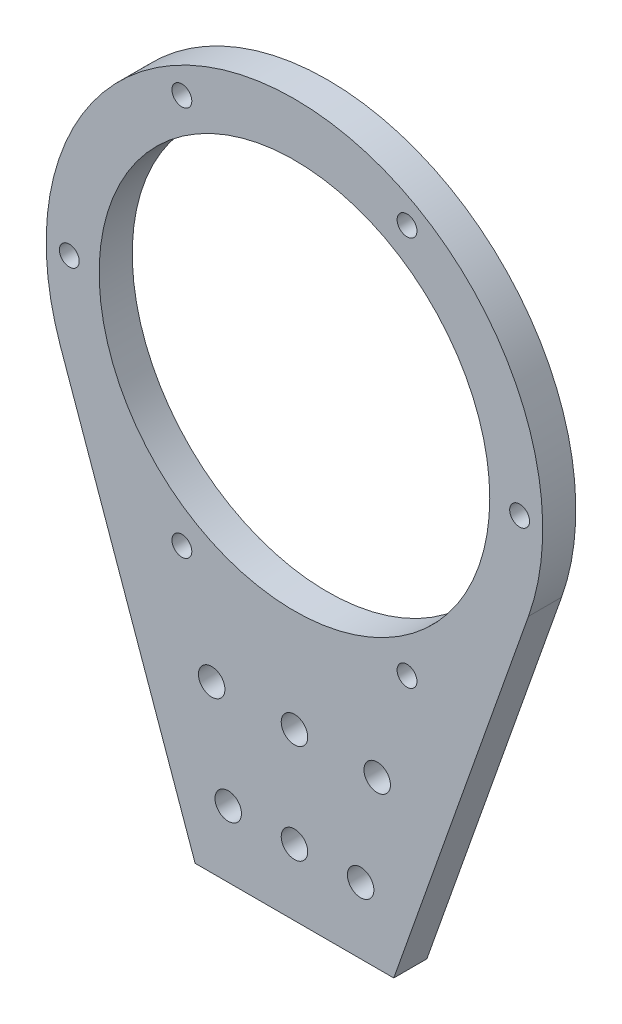
ISO-10303-21;
HEADER;
FILE_DESCRIPTION(('STEP AP214'),'2;1');
FILE_NAME('part.step','',(''),(''),'','','');
FILE_SCHEMA(('AUTOMOTIVE_DESIGN { 1 0 10303 214 1 1 1 1 }'));
ENDSEC;
DATA;
#1=APPLICATION_CONTEXT('core data for automotive mechanical design processes');
#2=APPLICATION_PROTOCOL_DEFINITION('international standard','automotive_design',2000,#1);
#3=PRODUCT_CONTEXT('',#1,'mechanical');
#4=PRODUCT('Part','Part','',(#3));
#5=PRODUCT_RELATED_PRODUCT_CATEGORY('part','',(#4));
#6=PRODUCT_DEFINITION_FORMATION('','',#4);
#7=PRODUCT_DEFINITION_CONTEXT('part definition',#1,'design');
#8=PRODUCT_DEFINITION('design','',#6,#7);
#9=PRODUCT_DEFINITION_SHAPE('','',#8);
#10=(LENGTH_UNIT() NAMED_UNIT(*) SI_UNIT(.MILLI.,.METRE.));
#11=(NAMED_UNIT(*) PLANE_ANGLE_UNIT() SI_UNIT($,.RADIAN.));
#12=(NAMED_UNIT(*) SI_UNIT($,.STERADIAN.) SOLID_ANGLE_UNIT());
#13=UNCERTAINTY_MEASURE_WITH_UNIT(LENGTH_MEASURE(1.E-05),#10,'distance_accuracy_value','');
#14=(GEOMETRIC_REPRESENTATION_CONTEXT(3) GLOBAL_UNCERTAINTY_ASSIGNED_CONTEXT((#13)) GLOBAL_UNIT_ASSIGNED_CONTEXT((#10,
#11,#12)) REPRESENTATION_CONTEXT('',''));
#15=CARTESIAN_POINT('',(0.,0.,0.));
#16=DIRECTION('',(0.,0.,1.));
#17=DIRECTION('',(1.,0.,0.));
#18=AXIS2_PLACEMENT_3D('',#15,#16,#17);
#19=CARTESIAN_POINT('',(0.,0.,0.));
#20=DIRECTION('',(0.,0.,1.));
#21=DIRECTION('',(1.,0.,0.));
#22=AXIS2_PLACEMENT_3D('',#19,#20,#21);
#23=PLANE('',#22);
#24=CARTESIAN_POINT('',(-17.0050000000002,29.4535239827087,0.));
#25=DIRECTION('',(0.,0.,1.));
#26=DIRECTION('',(1.,0.,0.));
#27=AXIS2_PLACEMENT_3D('',#24,#25,#26);
#28=CIRCLE('',#27,1.5);
#29=CARTESIAN_POINT('',(-15.5050000000001,29.4535239827087,0.));
#30=VERTEX_POINT('',#29);
#31=EDGE_CURVE('E199',#30,#30,#28,.T.);
#32=ORIENTED_EDGE('',*,*,#31,.T.);
#33=EDGE_LOOP('',(#32));
#34=FACE_BOUND('',#33,.T.);
#35=CARTESIAN_POINT('',(-34.01,0.,0.));
#36=DIRECTION('',(0.,0.,1.));
#37=DIRECTION('',(1.,0.,0.));
#38=AXIS2_PLACEMENT_3D('',#35,#36,#37);
#39=CIRCLE('',#38,1.5);
#40=CARTESIAN_POINT('',(-32.51,0.,0.));
#41=VERTEX_POINT('',#40);
#42=EDGE_CURVE('E202',#41,#41,#39,.T.);
#43=ORIENTED_EDGE('',*,*,#42,.T.);
#44=EDGE_LOOP('',(#43));
#45=FACE_BOUND('',#44,.T.);
#46=CARTESIAN_POINT('',(-17.0050000000001,-29.4535239827087,0.));
#47=DIRECTION('',(0.,0.,1.));
#48=DIRECTION('',(1.,0.,0.));
#49=AXIS2_PLACEMENT_3D('',#46,#47,#48);
#50=CIRCLE('',#49,1.5);
#51=CARTESIAN_POINT('',(-15.5050000000001,-29.4535239827087,0.));
#52=VERTEX_POINT('',#51);
#53=EDGE_CURVE('E205',#52,#52,#50,.T.);
#54=ORIENTED_EDGE('',*,*,#53,.T.);
#55=EDGE_LOOP('',(#54));
#56=FACE_BOUND('',#55,.T.);
#57=CARTESIAN_POINT('',(17.0050000000001,-29.4535239827087,0.));
#58=DIRECTION('',(0.,0.,1.));
#59=DIRECTION('',(1.,0.,0.));
#60=AXIS2_PLACEMENT_3D('',#57,#58,#59);
#61=CIRCLE('',#60,1.50000000000001);
#62=CARTESIAN_POINT('',(18.5050000000002,-29.4535239827087,0.));
#63=VERTEX_POINT('',#62);
#64=EDGE_CURVE('E208',#63,#63,#61,.T.);
#65=ORIENTED_EDGE('',*,*,#64,.T.);
#66=EDGE_LOOP('',(#65));
#67=FACE_BOUND('',#66,.T.);
#68=CARTESIAN_POINT('',(34.01,0.,0.));
#69=DIRECTION('',(0.,0.,1.));
#70=DIRECTION('',(1.,0.,0.));
#71=AXIS2_PLACEMENT_3D('',#68,#69,#70);
#72=CIRCLE('',#71,1.5);
#73=CARTESIAN_POINT('',(35.51,0.,0.));
#74=VERTEX_POINT('',#73);
#75=EDGE_CURVE('E211',#74,#74,#72,.T.);
#76=ORIENTED_EDGE('',*,*,#75,.T.);
#77=EDGE_LOOP('',(#76));
#78=FACE_BOUND('',#77,.T.);
#79=CARTESIAN_POINT('',(17.0050000000001,29.4535239827087,0.));
#80=DIRECTION('',(0.,0.,1.));
#81=DIRECTION('',(1.,0.,0.));
#82=AXIS2_PLACEMENT_3D('',#79,#80,#81);
#83=CIRCLE('',#82,1.5);
#84=CARTESIAN_POINT('',(18.5050000000001,29.4535239827087,0.));
#85=VERTEX_POINT('',#84);
#86=EDGE_CURVE('E214',#85,#85,#83,.T.);
#87=ORIENTED_EDGE('',*,*,#86,.T.);
#88=EDGE_LOOP('',(#87));
#89=FACE_BOUND('',#88,.T.);
#90=CARTESIAN_POINT('',(0.,-45.0000000000001,0.));
#91=DIRECTION('',(0.,0.,-1.));
#92=DIRECTION('',(-1.,0.,0.));
#93=AXIS2_PLACEMENT_3D('',#90,#91,#92);
#94=CIRCLE('',#93,2.);
#95=CARTESIAN_POINT('',(-2.,-45.0000000000001,0.));
#96=VERTEX_POINT('',#95);
#97=EDGE_CURVE('E184',#96,#96,#94,.T.);
#98=ORIENTED_EDGE('',*,*,#97,.F.);
#99=EDGE_LOOP('',(#98));
#100=FACE_BOUND('',#99,.T.);
#101=CARTESIAN_POINT('',(-12.5,-45.0000000000001,0.));
#102=DIRECTION('',(0.,0.,-1.));
#103=DIRECTION('',(-1.,0.,0.));
#104=AXIS2_PLACEMENT_3D('',#101,#102,#103);
#105=CIRCLE('',#104,2.00000000000001);
#106=CARTESIAN_POINT('',(-14.5,-45.0000000000001,0.));
#107=VERTEX_POINT('',#106);
#108=EDGE_CURVE('E192',#107,#107,#105,.T.);
#109=ORIENTED_EDGE('',*,*,#108,.F.);
#110=EDGE_LOOP('',(#109));
#111=FACE_BOUND('',#110,.T.);
#112=CARTESIAN_POINT('',(9.99999999999999,-60.0000000000001,0.));
#113=DIRECTION('',(0.,0.,-1.));
#114=DIRECTION('',(-1.,0.,0.));
#115=AXIS2_PLACEMENT_3D('',#112,#113,#114);
#116=CIRCLE('',#115,2.);
#117=CARTESIAN_POINT('',(7.99999999999999,-60.0000000000001,0.));
#118=VERTEX_POINT('',#117);
#119=EDGE_CURVE('E188',#118,#118,#116,.T.);
#120=ORIENTED_EDGE('',*,*,#119,.F.);
#121=EDGE_LOOP('',(#120));
#122=FACE_BOUND('',#121,.T.);
#123=CARTESIAN_POINT('',(0.,-60.0000000000001,0.));
#124=DIRECTION('',(0.,0.,-1.));
#125=DIRECTION('',(-1.,0.,0.));
#126=AXIS2_PLACEMENT_3D('',#123,#124,#125);
#127=CIRCLE('',#126,2.);
#128=CARTESIAN_POINT('',(-2.,-60.0000000000001,0.));
#129=VERTEX_POINT('',#128);
#130=EDGE_CURVE('E185',#129,#129,#127,.T.);
#131=ORIENTED_EDGE('',*,*,#130,.F.);
#132=EDGE_LOOP('',(#131));
#133=FACE_BOUND('',#132,.T.);
#134=CARTESIAN_POINT('',(-10.,-60.0000000000001,0.));
#135=DIRECTION('',(0.,0.,-1.));
#136=DIRECTION('',(-1.,0.,0.));
#137=AXIS2_PLACEMENT_3D('',#134,#135,#136);
#138=CIRCLE('',#137,2.00000000000001);
#139=CARTESIAN_POINT('',(-12.,-60.0000000000001,0.));
#140=VERTEX_POINT('',#139);
#141=EDGE_CURVE('E189',#140,#140,#138,.T.);
#142=ORIENTED_EDGE('',*,*,#141,.F.);
#143=EDGE_LOOP('',(#142));
#144=FACE_BOUND('',#143,.T.);
#145=CARTESIAN_POINT('',(12.5,-45.0000000000001,0.));
#146=DIRECTION('',(0.,0.,-1.));
#147=DIRECTION('',(-1.,0.,0.));
#148=AXIS2_PLACEMENT_3D('',#145,#146,#147);
#149=CIRCLE('',#148,2.);
#150=CARTESIAN_POINT('',(10.5,-45.0000000000001,0.));
#151=VERTEX_POINT('',#150);
#152=EDGE_CURVE('E127',#151,#151,#149,.T.);
#153=ORIENTED_EDGE('',*,*,#152,.F.);
#154=EDGE_LOOP('',(#153));
#155=FACE_BOUND('',#154,.T.);
#156=CARTESIAN_POINT('',(0.,0.,0.));
#157=DIRECTION('',(0.,0.,1.));
#158=DIRECTION('',(1.,0.,0.));
#159=AXIS2_PLACEMENT_3D('',#156,#157,#158);
#160=CIRCLE('',#159,37.5);
#161=CARTESIAN_POINT('',(35.3503084476468,-12.5142196183468,0.));
#162=VERTEX_POINT('',#161);
#163=CARTESIAN_POINT('',(-35.350308447636,-12.5142196183783,0.));
#164=VERTEX_POINT('',#163);
#165=EDGE_CURVE('E114',#162,#164,#160,.T.);
#166=ORIENTED_EDGE('',*,*,#165,.F.);
#167=DIRECTION('',(0.333712523155916,0.942674891937253,0.));
#168=VECTOR('',#167,1.);
#169=CARTESIAN_POINT('',(15.0000000000284,-70.0000000000001,0.));
#170=LINE('',#169,#168);
#171=CARTESIAN_POINT('',(15.0000000000284,-70.0000000000001,0.));
#172=VERTEX_POINT('',#171);
#173=EDGE_CURVE('E111',#172,#162,#170,.T.);
#174=ORIENTED_EDGE('',*,*,#173,.F.);
#175=DIRECTION('',(1.,0.,0.));
#176=VECTOR('',#175,1.);
#177=CARTESIAN_POINT('',(0.,-70.0000000000001,0.));
#178=LINE('',#177,#176);
#179=CARTESIAN_POINT('',(-14.9999999999716,-70.0000000000001,0.));
#180=VERTEX_POINT('',#179);
#181=EDGE_CURVE('E98',#180,#172,#178,.T.);
#182=ORIENTED_EDGE('',*,*,#181,.F.);
#183=DIRECTION('',(-0.333712523156753,0.942674891936957,0.));
#184=VECTOR('',#183,1.);
#185=CARTESIAN_POINT('',(-35.3503084476362,-12.5142196183783,0.));
#186=LINE('',#185,#184);
#187=EDGE_CURVE('E109',#180,#164,#186,.T.);
#188=ORIENTED_EDGE('',*,*,#187,.T.);
#189=EDGE_LOOP('',(#166,#174,#182,#188));
#190=FACE_BOUND('',#189,.T.);
#191=CARTESIAN_POINT('',(0.,0.,0.));
#192=DIRECTION('',(0.,0.,1.));
#193=DIRECTION('',(1.,0.,0.));
#194=AXIS2_PLACEMENT_3D('',#191,#192,#193);
#195=CIRCLE('',#194,29.5);
#196=CARTESIAN_POINT('',(29.5,0.,0.));
#197=VERTEX_POINT('',#196);
#198=EDGE_CURVE('E108',#197,#197,#195,.T.);
#199=ORIENTED_EDGE('',*,*,#198,.T.);
#200=EDGE_LOOP('',(#199));
#201=FACE_BOUND('',#200,.T.);
#202=ADVANCED_FACE('F61',(#34,#45,#56,#67,#78,#89,#100,#111,#122,#133,#144,#155,#190,#201),#23,.F.);
#203=CARTESIAN_POINT('',(0.,-70.0000000000001,5.));
#204=DIRECTION('',(0.,1.,0.));
#205=DIRECTION('',(0.,0.,1.));
#206=AXIS2_PLACEMENT_3D('',#203,#204,#205);
#207=PLANE('',#206);
#208=ORIENTED_EDGE('',*,*,#181,.T.);
#209=DIRECTION('',(0.,0.,-1.));
#210=VECTOR('',#209,1.);
#211=CARTESIAN_POINT('',(15.0000000000284,-70.0000000000001,5.));
#212=LINE('',#211,#210);
#213=CARTESIAN_POINT('',(15.0000000000284,-70.0000000000001,5.));
#214=VERTEX_POINT('',#213);
#215=EDGE_CURVE('E101',#214,#172,#212,.T.);
#216=ORIENTED_EDGE('',*,*,#215,.F.);
#217=DIRECTION('',(1.,0.,0.));
#218=VECTOR('',#217,1.);
#219=CARTESIAN_POINT('',(0.,-70.0000000000001,5.));
#220=LINE('',#219,#218);
#221=CARTESIAN_POINT('',(-14.9999999999716,-70.0000000000001,5.));
#222=VERTEX_POINT('',#221);
#223=EDGE_CURVE('E89',#222,#214,#220,.T.);
#224=ORIENTED_EDGE('',*,*,#223,.F.);
#225=DIRECTION('',(0.,0.,-1.));
#226=VECTOR('',#225,1.);
#227=CARTESIAN_POINT('',(-14.9999999999716,-70.0000000000001,5.));
#228=LINE('',#227,#226);
#229=EDGE_CURVE('E103',#222,#180,#228,.T.);
#230=ORIENTED_EDGE('',*,*,#229,.T.);
#231=EDGE_LOOP('',(#208,#216,#224,#230));
#232=FACE_BOUND('',#231,.T.);
#233=ADVANCED_FACE('F100',(#232),#207,.F.);
#234=CARTESIAN_POINT('',(-35.3503084476362,-12.5142196183783,5.));
#235=DIRECTION('',(-0.942674891936957,-0.333712523156753,0.));
#236=DIRECTION('',(0.333712523156753,-0.942674891936957,0.));
#237=AXIS2_PLACEMENT_3D('',#234,#235,#236);
#238=PLANE('',#237);
#239=ORIENTED_EDGE('',*,*,#187,.F.);
#240=ORIENTED_EDGE('',*,*,#229,.F.);
#241=DIRECTION('',(-0.333712523156753,0.942674891936957,0.));
#242=VECTOR('',#241,1.);
#243=CARTESIAN_POINT('',(-35.3503084476362,-12.5142196183783,5.));
#244=LINE('',#243,#242);
#245=CARTESIAN_POINT('',(-35.350308447636,-12.5142196183783,5.));
#246=VERTEX_POINT('',#245);
#247=EDGE_CURVE('E166',#222,#246,#244,.T.);
#248=ORIENTED_EDGE('',*,*,#247,.T.);
#249=DIRECTION('',(0.,0.,-1.));
#250=VECTOR('',#249,1.);
#251=CARTESIAN_POINT('',(-35.350308447636,-12.5142196183783,5.));
#252=LINE('',#251,#250);
#253=EDGE_CURVE('E71',#246,#164,#252,.T.);
#254=ORIENTED_EDGE('',*,*,#253,.T.);
#255=EDGE_LOOP('',(#239,#240,#248,#254));
#256=FACE_BOUND('',#255,.T.);
#257=ADVANCED_FACE('F145',(#256),#238,.T.);
#258=CARTESIAN_POINT('',(0.,0.,5.));
#259=DIRECTION('',(0.,0.,1.));
#260=DIRECTION('',(1.,0.,0.));
#261=AXIS2_PLACEMENT_3D('',#258,#259,#260);
#262=PLANE('',#261);
#263=CARTESIAN_POINT('',(-17.0050000000002,29.4535239827087,5.));
#264=DIRECTION('',(0.,0.,1.));
#265=DIRECTION('',(1.,0.,0.));
#266=AXIS2_PLACEMENT_3D('',#263,#264,#265);
#267=CIRCLE('',#266,1.5);
#268=CARTESIAN_POINT('',(-15.5050000000001,29.4535239827087,5.));
#269=VERTEX_POINT('',#268);
#270=EDGE_CURVE('E221',#269,#269,#267,.T.);
#271=ORIENTED_EDGE('',*,*,#270,.F.);
#272=EDGE_LOOP('',(#271));
#273=FACE_BOUND('',#272,.T.);
#274=CARTESIAN_POINT('',(-34.01,0.,5.));
#275=DIRECTION('',(0.,0.,1.));
#276=DIRECTION('',(1.,0.,0.));
#277=AXIS2_PLACEMENT_3D('',#274,#275,#276);
#278=CIRCLE('',#277,1.5);
#279=CARTESIAN_POINT('',(-32.51,0.,5.));
#280=VERTEX_POINT('',#279);
#281=EDGE_CURVE('E224',#280,#280,#278,.T.);
#282=ORIENTED_EDGE('',*,*,#281,.F.);
#283=EDGE_LOOP('',(#282));
#284=FACE_BOUND('',#283,.T.);
#285=CARTESIAN_POINT('',(-17.0050000000001,-29.4535239827087,5.));
#286=DIRECTION('',(0.,0.,1.));
#287=DIRECTION('',(1.,0.,0.));
#288=AXIS2_PLACEMENT_3D('',#285,#286,#287);
#289=CIRCLE('',#288,1.5);
#290=CARTESIAN_POINT('',(-15.5050000000001,-29.4535239827087,5.));
#291=VERTEX_POINT('',#290);
#292=EDGE_CURVE('E227',#291,#291,#289,.T.);
#293=ORIENTED_EDGE('',*,*,#292,.F.);
#294=EDGE_LOOP('',(#293));
#295=FACE_BOUND('',#294,.T.);
#296=CARTESIAN_POINT('',(17.0050000000001,-29.4535239827087,5.));
#297=DIRECTION('',(0.,0.,1.));
#298=DIRECTION('',(1.,0.,0.));
#299=AXIS2_PLACEMENT_3D('',#296,#297,#298);
#300=CIRCLE('',#299,1.50000000000001);
#301=CARTESIAN_POINT('',(18.5050000000002,-29.4535239827087,5.));
#302=VERTEX_POINT('',#301);
#303=EDGE_CURVE('E230',#302,#302,#300,.T.);
#304=ORIENTED_EDGE('',*,*,#303,.F.);
#305=EDGE_LOOP('',(#304));
#306=FACE_BOUND('',#305,.T.);
#307=CARTESIAN_POINT('',(34.01,0.,5.));
#308=DIRECTION('',(0.,0.,1.));
#309=DIRECTION('',(1.,0.,0.));
#310=AXIS2_PLACEMENT_3D('',#307,#308,#309);
#311=CIRCLE('',#310,1.5);
#312=CARTESIAN_POINT('',(35.51,0.,5.));
#313=VERTEX_POINT('',#312);
#314=EDGE_CURVE('E220',#313,#313,#311,.T.);
#315=ORIENTED_EDGE('',*,*,#314,.F.);
#316=EDGE_LOOP('',(#315));
#317=FACE_BOUND('',#316,.T.);
#318=CARTESIAN_POINT('',(17.0050000000001,29.4535239827087,5.));
#319=DIRECTION('',(0.,0.,1.));
#320=DIRECTION('',(1.,0.,0.));
#321=AXIS2_PLACEMENT_3D('',#318,#319,#320);
#322=CIRCLE('',#321,1.5);
#323=CARTESIAN_POINT('',(18.5050000000001,29.4535239827087,5.));
#324=VERTEX_POINT('',#323);
#325=EDGE_CURVE('E217',#324,#324,#322,.T.);
#326=ORIENTED_EDGE('',*,*,#325,.F.);
#327=EDGE_LOOP('',(#326));
#328=FACE_BOUND('',#327,.T.);
#329=CARTESIAN_POINT('',(0.,-45.0000000000001,5.));
#330=DIRECTION('',(0.,0.,1.));
#331=DIRECTION('',(1.,0.,0.));
#332=AXIS2_PLACEMENT_3D('',#329,#330,#331);
#333=CIRCLE('',#332,2.);
#334=CARTESIAN_POINT('',(2.,-45.0000000000001,5.));
#335=VERTEX_POINT('',#334);
#336=EDGE_CURVE('E65',#335,#335,#333,.T.);
#337=ORIENTED_EDGE('',*,*,#336,.F.);
#338=EDGE_LOOP('',(#337));
#339=FACE_BOUND('',#338,.T.);
#340=CARTESIAN_POINT('',(-12.5,-45.0000000000001,5.));
#341=DIRECTION('',(0.,0.,1.));
#342=DIRECTION('',(1.,0.,0.));
#343=AXIS2_PLACEMENT_3D('',#340,#341,#342);
#344=CIRCLE('',#343,2.00000000000001);
#345=CARTESIAN_POINT('',(-10.5,-45.0000000000001,5.));
#346=VERTEX_POINT('',#345);
#347=EDGE_CURVE('E121',#346,#346,#344,.T.);
#348=ORIENTED_EDGE('',*,*,#347,.F.);
#349=EDGE_LOOP('',(#348));
#350=FACE_BOUND('',#349,.T.);
#351=CARTESIAN_POINT('',(9.99999999999999,-60.0000000000001,5.));
#352=DIRECTION('',(0.,0.,1.));
#353=DIRECTION('',(1.,0.,0.));
#354=AXIS2_PLACEMENT_3D('',#351,#352,#353);
#355=CIRCLE('',#354,2.);
#356=CARTESIAN_POINT('',(12.,-60.0000000000001,5.));
#357=VERTEX_POINT('',#356);
#358=EDGE_CURVE('E133',#357,#357,#355,.T.);
#359=ORIENTED_EDGE('',*,*,#358,.F.);
#360=EDGE_LOOP('',(#359));
#361=FACE_BOUND('',#360,.T.);
#362=CARTESIAN_POINT('',(0.,-60.0000000000001,5.));
#363=DIRECTION('',(0.,0.,1.));
#364=DIRECTION('',(1.,0.,0.));
#365=AXIS2_PLACEMENT_3D('',#362,#363,#364);
#366=CIRCLE('',#365,2.);
#367=CARTESIAN_POINT('',(2.,-60.0000000000001,5.));
#368=VERTEX_POINT('',#367);
#369=EDGE_CURVE('E130',#368,#368,#366,.T.);
#370=ORIENTED_EDGE('',*,*,#369,.F.);
#371=EDGE_LOOP('',(#370));
#372=FACE_BOUND('',#371,.T.);
#373=CARTESIAN_POINT('',(-10.,-60.0000000000001,5.));
#374=DIRECTION('',(0.,0.,1.));
#375=DIRECTION('',(1.,0.,0.));
#376=AXIS2_PLACEMENT_3D('',#373,#374,#375);
#377=CIRCLE('',#376,2.00000000000001);
#378=CARTESIAN_POINT('',(-8.00000000000001,-60.0000000000001,5.));
#379=VERTEX_POINT('',#378);
#380=EDGE_CURVE('E126',#379,#379,#377,.T.);
#381=ORIENTED_EDGE('',*,*,#380,.F.);
#382=EDGE_LOOP('',(#381));
#383=FACE_BOUND('',#382,.T.);
#384=CARTESIAN_POINT('',(12.5,-45.0000000000001,5.));
#385=DIRECTION('',(0.,0.,1.));
#386=DIRECTION('',(1.,0.,0.));
#387=AXIS2_PLACEMENT_3D('',#384,#385,#386);
#388=CIRCLE('',#387,2.);
#389=CARTESIAN_POINT('',(14.5,-45.0000000000001,5.));
#390=VERTEX_POINT('',#389);
#391=EDGE_CURVE('E123',#390,#390,#388,.T.);
#392=ORIENTED_EDGE('',*,*,#391,.F.);
#393=EDGE_LOOP('',(#392));
#394=FACE_BOUND('',#393,.T.);
#395=DIRECTION('',(0.333712523155916,0.942674891937253,0.));
#396=VECTOR('',#395,1.);
#397=CARTESIAN_POINT('',(15.0000000000284,-70.0000000000001,5.));
#398=LINE('',#397,#396);
#399=CARTESIAN_POINT('',(35.3503084476468,-12.5142196183468,5.));
#400=VERTEX_POINT('',#399);
#401=EDGE_CURVE('E113',#214,#400,#398,.T.);
#402=ORIENTED_EDGE('',*,*,#401,.T.);
#403=CARTESIAN_POINT('',(0.,0.,5.));
#404=DIRECTION('',(0.,0.,1.));
#405=DIRECTION('',(1.,0.,0.));
#406=AXIS2_PLACEMENT_3D('',#403,#404,#405);
#407=CIRCLE('',#406,37.5);
#408=EDGE_CURVE('E173',#400,#246,#407,.T.);
#409=ORIENTED_EDGE('',*,*,#408,.T.);
#410=ORIENTED_EDGE('',*,*,#247,.F.);
#411=ORIENTED_EDGE('',*,*,#223,.T.);
#412=EDGE_LOOP('',(#402,#409,#410,#411));
#413=FACE_BOUND('',#412,.T.);
#414=CARTESIAN_POINT('',(0.,0.,5.));
#415=DIRECTION('',(0.,0.,1.));
#416=DIRECTION('',(1.,0.,0.));
#417=AXIS2_PLACEMENT_3D('',#414,#415,#416);
#418=CIRCLE('',#417,29.5);
#419=CARTESIAN_POINT('',(29.5,0.,5.));
#420=VERTEX_POINT('',#419);
#421=EDGE_CURVE('E162',#420,#420,#418,.T.);
#422=ORIENTED_EDGE('',*,*,#421,.F.);
#423=EDGE_LOOP('',(#422));
#424=FACE_BOUND('',#423,.T.);
#425=ADVANCED_FACE('F141',(#273,#284,#295,#306,#317,#328,#339,#350,#361,#372,#383,#394,#413,
#424),#262,.T.);
#426=CARTESIAN_POINT('',(0.,0.,5.));
#427=DIRECTION('',(0.,0.,-1.));
#428=DIRECTION('',(-1.,0.,0.));
#429=AXIS2_PLACEMENT_3D('',#426,#427,#428);
#430=CYLINDRICAL_SURFACE('',#429,37.5);
#431=ORIENTED_EDGE('',*,*,#408,.F.);
#432=DIRECTION('',(0.,0.,-1.));
#433=VECTOR('',#432,1.);
#434=CARTESIAN_POINT('',(35.3503084476469,-12.5142196183468,5.));
#435=LINE('',#434,#433);
#436=EDGE_CURVE('E12',#400,#162,#435,.T.);
#437=ORIENTED_EDGE('',*,*,#436,.T.);
#438=ORIENTED_EDGE('',*,*,#165,.T.);
#439=ORIENTED_EDGE('',*,*,#253,.F.);
#440=EDGE_LOOP('',(#431,#437,#438,#439));
#441=FACE_BOUND('',#440,.T.);
#442=ADVANCED_FACE('F144',(#441),#430,.T.);
#443=CARTESIAN_POINT('',(0.,0.,5.));
#444=DIRECTION('',(0.,0.,-1.));
#445=DIRECTION('',(-1.,0.,0.));
#446=AXIS2_PLACEMENT_3D('',#443,#444,#445);
#447=CYLINDRICAL_SURFACE('',#446,29.5);
#448=ORIENTED_EDGE('',*,*,#421,.T.);
#449=EDGE_LOOP('',(#448));
#450=FACE_BOUND('',#449,.T.);
#451=ORIENTED_EDGE('',*,*,#198,.F.);
#452=EDGE_LOOP('',(#451));
#453=FACE_BOUND('',#452,.T.);
#454=ADVANCED_FACE('F149',(#450,#453),#447,.F.);
#455=CARTESIAN_POINT('',(15.0000000000284,-70.0000000000001,5.));
#456=DIRECTION('',(-0.942674891937253,0.333712523155916,0.));
#457=DIRECTION('',(-0.333712523155916,-0.942674891937253,0.));
#458=AXIS2_PLACEMENT_3D('',#455,#456,#457);
#459=PLANE('',#458);
#460=ORIENTED_EDGE('',*,*,#173,.T.);
#461=ORIENTED_EDGE('',*,*,#436,.F.);
#462=ORIENTED_EDGE('',*,*,#401,.F.);
#463=ORIENTED_EDGE('',*,*,#215,.T.);
#464=EDGE_LOOP('',(#460,#461,#462,#463));
#465=FACE_BOUND('',#464,.T.);
#466=ADVANCED_FACE('F63',(#465),#459,.F.);
#467=CARTESIAN_POINT('',(12.5,-45.0000000000001,7.));
#468=DIRECTION('',(0.,0.,-1.));
#469=DIRECTION('',(-1.,0.,0.));
#470=AXIS2_PLACEMENT_3D('',#467,#468,#469);
#471=CYLINDRICAL_SURFACE('',#470,2.);
#472=ORIENTED_EDGE('',*,*,#391,.T.);
#473=EDGE_LOOP('',(#472));
#474=FACE_BOUND('',#473,.T.);
#475=ORIENTED_EDGE('',*,*,#152,.T.);
#476=EDGE_LOOP('',(#475));
#477=FACE_BOUND('',#476,.T.);
#478=ADVANCED_FACE('F148',(#474,#477),#471,.F.);
#479=CARTESIAN_POINT('',(-10.,-60.0000000000001,7.));
#480=DIRECTION('',(0.,0.,-1.));
#481=DIRECTION('',(-1.,0.,0.));
#482=AXIS2_PLACEMENT_3D('',#479,#480,#481);
#483=CYLINDRICAL_SURFACE('',#482,2.00000000000001);
#484=ORIENTED_EDGE('',*,*,#380,.T.);
#485=EDGE_LOOP('',(#484));
#486=FACE_BOUND('',#485,.T.);
#487=ORIENTED_EDGE('',*,*,#141,.T.);
#488=EDGE_LOOP('',(#487));
#489=FACE_BOUND('',#488,.T.);
#490=ADVANCED_FACE('F266',(#486,#489),#483,.F.);
#491=CARTESIAN_POINT('',(0.,-60.0000000000001,7.));
#492=DIRECTION('',(0.,0.,-1.));
#493=DIRECTION('',(-1.,0.,0.));
#494=AXIS2_PLACEMENT_3D('',#491,#492,#493);
#495=CYLINDRICAL_SURFACE('',#494,2.);
#496=ORIENTED_EDGE('',*,*,#369,.T.);
#497=EDGE_LOOP('',(#496));
#498=FACE_BOUND('',#497,.T.);
#499=ORIENTED_EDGE('',*,*,#130,.T.);
#500=EDGE_LOOP('',(#499));
#501=FACE_BOUND('',#500,.T.);
#502=ADVANCED_FACE('F273',(#498,#501),#495,.F.);
#503=CARTESIAN_POINT('',(9.99999999999999,-60.0000000000001,7.));
#504=DIRECTION('',(0.,0.,-1.));
#505=DIRECTION('',(-1.,0.,0.));
#506=AXIS2_PLACEMENT_3D('',#503,#504,#505);
#507=CYLINDRICAL_SURFACE('',#506,2.);
#508=ORIENTED_EDGE('',*,*,#358,.T.);
#509=EDGE_LOOP('',(#508));
#510=FACE_BOUND('',#509,.T.);
#511=ORIENTED_EDGE('',*,*,#119,.T.);
#512=EDGE_LOOP('',(#511));
#513=FACE_BOUND('',#512,.T.);
#514=ADVANCED_FACE('F315',(#510,#513),#507,.F.);
#515=CARTESIAN_POINT('',(-12.5,-45.0000000000001,7.));
#516=DIRECTION('',(0.,0.,-1.));
#517=DIRECTION('',(-1.,0.,0.));
#518=AXIS2_PLACEMENT_3D('',#515,#516,#517);
#519=CYLINDRICAL_SURFACE('',#518,2.00000000000001);
#520=ORIENTED_EDGE('',*,*,#347,.T.);
#521=EDGE_LOOP('',(#520));
#522=FACE_BOUND('',#521,.T.);
#523=ORIENTED_EDGE('',*,*,#108,.T.);
#524=EDGE_LOOP('',(#523));
#525=FACE_BOUND('',#524,.T.);
#526=ADVANCED_FACE('F138',(#522,#525),#519,.F.);
#527=CARTESIAN_POINT('',(0.,-45.0000000000001,7.));
#528=DIRECTION('',(0.,0.,-1.));
#529=DIRECTION('',(-1.,0.,0.));
#530=AXIS2_PLACEMENT_3D('',#527,#528,#529);
#531=CYLINDRICAL_SURFACE('',#530,2.);
#532=ORIENTED_EDGE('',*,*,#336,.T.);
#533=EDGE_LOOP('',(#532));
#534=FACE_BOUND('',#533,.T.);
#535=ORIENTED_EDGE('',*,*,#97,.T.);
#536=EDGE_LOOP('',(#535));
#537=FACE_BOUND('',#536,.T.);
#538=ADVANCED_FACE('F244',(#534,#537),#531,.F.);
#539=CARTESIAN_POINT('',(17.0050000000001,29.4535239827087,-2.));
#540=DIRECTION('',(0.,0.,1.));
#541=DIRECTION('',(1.,0.,0.));
#542=AXIS2_PLACEMENT_3D('',#539,#540,#541);
#543=CYLINDRICAL_SURFACE('',#542,1.5);
#544=ORIENTED_EDGE('',*,*,#325,.T.);
#545=EDGE_LOOP('',(#544));
#546=FACE_BOUND('',#545,.T.);
#547=ORIENTED_EDGE('',*,*,#86,.F.);
#548=EDGE_LOOP('',(#547));
#549=FACE_BOUND('',#548,.T.);
#550=ADVANCED_FACE('F247',(#546,#549),#543,.F.);
#551=CARTESIAN_POINT('',(34.01,0.,-2.));
#552=DIRECTION('',(0.,0.,1.));
#553=DIRECTION('',(1.,0.,0.));
#554=AXIS2_PLACEMENT_3D('',#551,#552,#553);
#555=CYLINDRICAL_SURFACE('',#554,1.5);
#556=ORIENTED_EDGE('',*,*,#314,.T.);
#557=EDGE_LOOP('',(#556));
#558=FACE_BOUND('',#557,.T.);
#559=ORIENTED_EDGE('',*,*,#75,.F.);
#560=EDGE_LOOP('',(#559));
#561=FACE_BOUND('',#560,.T.);
#562=ADVANCED_FACE('F236',(#558,#561),#555,.F.);
#563=CARTESIAN_POINT('',(17.0050000000001,-29.4535239827087,-2.));
#564=DIRECTION('',(0.,0.,1.));
#565=DIRECTION('',(1.,0.,0.));
#566=AXIS2_PLACEMENT_3D('',#563,#564,#565);
#567=CYLINDRICAL_SURFACE('',#566,1.50000000000001);
#568=ORIENTED_EDGE('',*,*,#303,.T.);
#569=EDGE_LOOP('',(#568));
#570=FACE_BOUND('',#569,.T.);
#571=ORIENTED_EDGE('',*,*,#64,.F.);
#572=EDGE_LOOP('',(#571));
#573=FACE_BOUND('',#572,.T.);
#574=ADVANCED_FACE('F372',(#570,#573),#567,.F.);
#575=CARTESIAN_POINT('',(-17.0050000000001,-29.4535239827087,-2.));
#576=DIRECTION('',(0.,0.,1.));
#577=DIRECTION('',(1.,0.,0.));
#578=AXIS2_PLACEMENT_3D('',#575,#576,#577);
#579=CYLINDRICAL_SURFACE('',#578,1.5);
#580=ORIENTED_EDGE('',*,*,#292,.T.);
#581=EDGE_LOOP('',(#580));
#582=FACE_BOUND('',#581,.T.);
#583=ORIENTED_EDGE('',*,*,#53,.F.);
#584=EDGE_LOOP('',(#583));
#585=FACE_BOUND('',#584,.T.);
#586=ADVANCED_FACE('F381',(#582,#585),#579,.F.);
#587=CARTESIAN_POINT('',(-34.01,0.,-2.));
#588=DIRECTION('',(0.,0.,1.));
#589=DIRECTION('',(1.,0.,0.));
#590=AXIS2_PLACEMENT_3D('',#587,#588,#589);
#591=CYLINDRICAL_SURFACE('',#590,1.5);
#592=ORIENTED_EDGE('',*,*,#281,.T.);
#593=EDGE_LOOP('',(#592));
#594=FACE_BOUND('',#593,.T.);
#595=ORIENTED_EDGE('',*,*,#42,.F.);
#596=EDGE_LOOP('',(#595));
#597=FACE_BOUND('',#596,.T.);
#598=ADVANCED_FACE('F391',(#594,#597),#591,.F.);
#599=CARTESIAN_POINT('',(-17.0050000000002,29.4535239827087,-2.));
#600=DIRECTION('',(0.,0.,1.));
#601=DIRECTION('',(1.,0.,0.));
#602=AXIS2_PLACEMENT_3D('',#599,#600,#601);
#603=CYLINDRICAL_SURFACE('',#602,1.5);
#604=ORIENTED_EDGE('',*,*,#270,.T.);
#605=EDGE_LOOP('',(#604));
#606=FACE_BOUND('',#605,.T.);
#607=ORIENTED_EDGE('',*,*,#31,.F.);
#608=EDGE_LOOP('',(#607));
#609=FACE_BOUND('',#608,.T.);
#610=ADVANCED_FACE('F401',(#606,#609),#603,.F.);
#611=CLOSED_SHELL('',(#202,#233,#257,#425,#442,#454,#466,#478,#490,#502,#514,#526,#538,#550,
#562,#574,#586,#598,#610));
#612=MANIFOLD_SOLID_BREP('B2',#611);
#613=ADVANCED_BREP_SHAPE_REPRESENTATION('',(#18,#612),#14);
#614=SHAPE_DEFINITION_REPRESENTATION(#9,#613);
ENDSEC;
END-ISO-10303-21;
